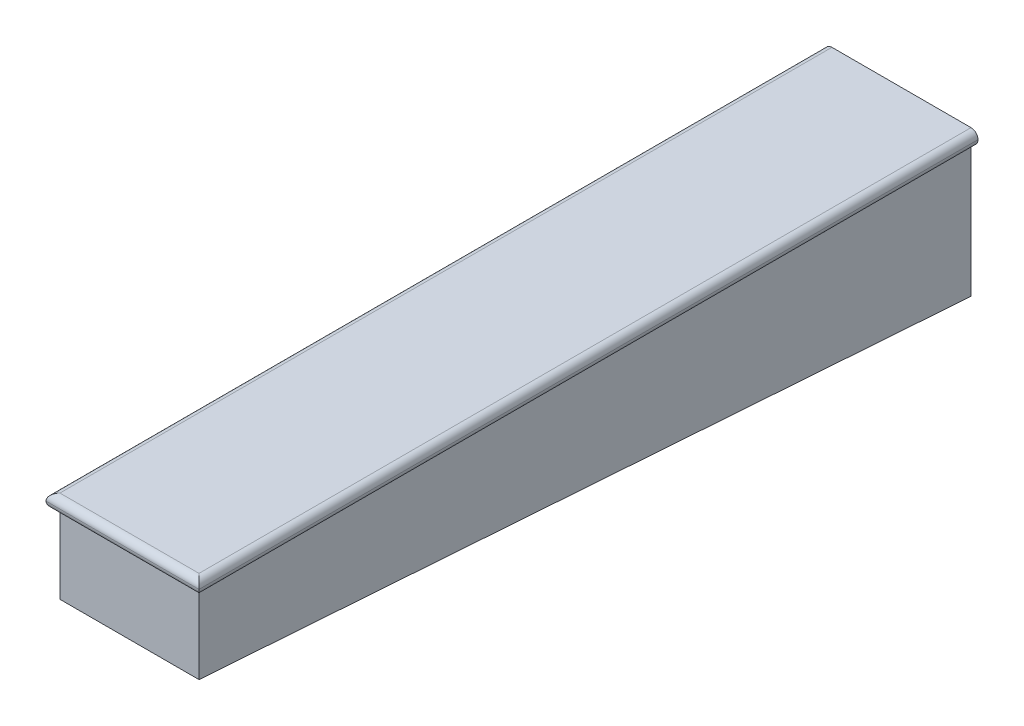
ISO-10303-21;
HEADER;
FILE_DESCRIPTION(('STEP AP214'),'2;1');
FILE_NAME('part.step','',(''),(''),'','','');
FILE_SCHEMA(('AUTOMOTIVE_DESIGN { 1 0 10303 214 1 1 1 1 }'));
ENDSEC;
DATA;
#1=APPLICATION_CONTEXT('core data for automotive mechanical design processes');
#2=APPLICATION_PROTOCOL_DEFINITION('international standard','automotive_design',2000,#1);
#3=PRODUCT_CONTEXT('',#1,'mechanical');
#4=PRODUCT('Part','Part','',(#3));
#5=PRODUCT_RELATED_PRODUCT_CATEGORY('part','',(#4));
#6=PRODUCT_DEFINITION_FORMATION('','',#4);
#7=PRODUCT_DEFINITION_CONTEXT('part definition',#1,'design');
#8=PRODUCT_DEFINITION('design','',#6,#7);
#9=PRODUCT_DEFINITION_SHAPE('','',#8);
#10=(LENGTH_UNIT() NAMED_UNIT(*) SI_UNIT(.MILLI.,.METRE.));
#11=(NAMED_UNIT(*) PLANE_ANGLE_UNIT() SI_UNIT($,.RADIAN.));
#12=(NAMED_UNIT(*) SI_UNIT($,.STERADIAN.) SOLID_ANGLE_UNIT());
#13=UNCERTAINTY_MEASURE_WITH_UNIT(LENGTH_MEASURE(1.E-05),#10,'distance_accuracy_value','');
#14=(GEOMETRIC_REPRESENTATION_CONTEXT(3) GLOBAL_UNCERTAINTY_ASSIGNED_CONTEXT((#13)) GLOBAL_UNIT_ASSIGNED_CONTEXT((#10,
#11,#12)) REPRESENTATION_CONTEXT('',''));
#15=CARTESIAN_POINT('',(0.,0.,0.));
#16=DIRECTION('',(0.,0.,1.));
#17=DIRECTION('',(1.,0.,0.));
#18=AXIS2_PLACEMENT_3D('',#15,#16,#17);
#19=CARTESIAN_POINT('',(0.,21.,0.));
#20=DIRECTION('',(0.,0.,1.));
#21=DIRECTION('',(1.,0.,0.));
#22=AXIS2_PLACEMENT_3D('',#19,#20,#21);
#23=PLANE('',#22);
#24=CARTESIAN_POINT('',(21.,20.,0.));
#25=DIRECTION('',(0.,0.,1.));
#26=DIRECTION('',(1.,0.,0.));
#27=AXIS2_PLACEMENT_3D('',#24,#25,#26);
#28=CIRCLE('',#27,1.);
#29=CARTESIAN_POINT('',(21.,21.,0.));
#30=VERTEX_POINT('',#29);
#31=CARTESIAN_POINT('',(22.,20.,0.));
#32=VERTEX_POINT('',#31);
#33=EDGE_CURVE('E121',#30,#32,#28,.F.);
#34=ORIENTED_EDGE('',*,*,#33,.T.);
#35=CARTESIAN_POINT('',(21.,20.,0.));
#36=DIRECTION('',(0.,0.,1.));
#37=DIRECTION('',(1.,0.,0.));
#38=AXIS2_PLACEMENT_3D('',#35,#36,#37);
#39=CIRCLE('',#38,1.);
#40=CARTESIAN_POINT('',(21.,19.,0.));
#41=VERTEX_POINT('',#40);
#42=EDGE_CURVE('E125',#32,#41,#39,.F.);
#43=ORIENTED_EDGE('',*,*,#42,.T.);
#44=DIRECTION('',(0.,-1.,0.));
#45=VECTOR('',#44,1.);
#46=CARTESIAN_POINT('',(21.,135.140264587042,0.));
#47=LINE('',#46,#45);
#48=CARTESIAN_POINT('',(21.,0.,0.));
#49=VERTEX_POINT('',#48);
#50=EDGE_CURVE('E168',#41,#49,#47,.T.);
#51=ORIENTED_EDGE('',*,*,#50,.T.);
#52=DIRECTION('',(-1.,0.,0.));
#53=VECTOR('',#52,1.);
#54=CARTESIAN_POINT('',(0.,0.,0.));
#55=LINE('',#54,#53);
#56=CARTESIAN_POINT('',(1.00000000000001,0.,0.));
#57=VERTEX_POINT('',#56);
#58=EDGE_CURVE('E186',#49,#57,#55,.T.);
#59=ORIENTED_EDGE('',*,*,#58,.T.);
#60=DIRECTION('',(0.,-1.,0.));
#61=VECTOR('',#60,1.);
#62=CARTESIAN_POINT('',(1.00000000000001,135.140264587042,0.));
#63=LINE('',#62,#61);
#64=CARTESIAN_POINT('',(1.00000000000001,19.,0.));
#65=VERTEX_POINT('',#64);
#66=EDGE_CURVE('E181',#65,#57,#63,.T.);
#67=ORIENTED_EDGE('',*,*,#66,.F.);
#68=CARTESIAN_POINT('',(1.,20.,0.));
#69=DIRECTION('',(0.,0.,1.));
#70=DIRECTION('',(1.,0.,0.));
#71=AXIS2_PLACEMENT_3D('',#68,#69,#70);
#72=CIRCLE('',#71,1.);
#73=CARTESIAN_POINT('',(0.,20.,0.));
#74=VERTEX_POINT('',#73);
#75=EDGE_CURVE('E132',#65,#74,#72,.F.);
#76=ORIENTED_EDGE('',*,*,#75,.T.);
#77=CARTESIAN_POINT('',(1.,20.,0.));
#78=DIRECTION('',(0.,0.,1.));
#79=DIRECTION('',(1.,0.,0.));
#80=AXIS2_PLACEMENT_3D('',#77,#78,#79);
#81=CIRCLE('',#80,1.);
#82=CARTESIAN_POINT('',(1.,21.,0.));
#83=VERTEX_POINT('',#82);
#84=EDGE_CURVE('E185',#74,#83,#81,.F.);
#85=ORIENTED_EDGE('',*,*,#84,.T.);
#86=DIRECTION('',(-1.,0.,0.));
#87=VECTOR('',#86,1.);
#88=CARTESIAN_POINT('',(0.,21.,0.));
#89=LINE('',#88,#87);
#90=EDGE_CURVE('E128',#30,#83,#89,.T.);
#91=ORIENTED_EDGE('',*,*,#90,.F.);
#92=EDGE_LOOP('',(#34,#43,#51,#59,#67,#76,#85,#91));
#93=FACE_BOUND('',#92,.T.);
#94=ADVANCED_FACE('F47',(#93),#23,.F.);
#95=CARTESIAN_POINT('',(0.,21.,0.));
#96=DIRECTION('',(0.,1.,0.));
#97=DIRECTION('',(0.,0.,1.));
#98=AXIS2_PLACEMENT_3D('',#95,#96,#97);
#99=PLANE('',#98);
#100=DIRECTION('',(1.,0.,0.));
#101=VECTOR('',#100,1.);
#102=CARTESIAN_POINT('',(22.,21.,111.));
#103=LINE('',#102,#101);
#104=CARTESIAN_POINT('',(1.00000000000001,21.,111.));
#105=VERTEX_POINT('',#104);
#106=CARTESIAN_POINT('',(21.,21.,111.));
#107=VERTEX_POINT('',#106);
#108=EDGE_CURVE('E73',#105,#107,#103,.T.);
#109=ORIENTED_EDGE('',*,*,#108,.T.);
#110=DIRECTION('',(0.,0.,-1.));
#111=VECTOR('',#110,1.);
#112=CARTESIAN_POINT('',(21.,21.,0.));
#113=LINE('',#112,#111);
#114=EDGE_CURVE('E12',#107,#30,#113,.T.);
#115=ORIENTED_EDGE('',*,*,#114,.T.);
#116=ORIENTED_EDGE('',*,*,#90,.T.);
#117=DIRECTION('',(0.,0.,1.));
#118=VECTOR('',#117,1.);
#119=CARTESIAN_POINT('',(1.00000000000001,21.,112.));
#120=LINE('',#119,#118);
#121=EDGE_CURVE('E57',#83,#105,#120,.T.);
#122=ORIENTED_EDGE('',*,*,#121,.T.);
#123=EDGE_LOOP('',(#109,#115,#116,#122));
#124=FACE_BOUND('',#123,.T.);
#125=ADVANCED_FACE('F196',(#124),#99,.T.);
#126=CARTESIAN_POINT('',(21.,135.140264587042,0.));
#127=DIRECTION('',(1.,0.,0.));
#128=DIRECTION('',(0.,0.,-1.));
#129=AXIS2_PLACEMENT_3D('',#126,#127,#128);
#130=PLANE('',#129);
#131=DIRECTION('',(0.,0.0698087234221514,0.997560395231371));
#132=VECTOR('',#131,1.);
#133=CARTESIAN_POINT('',(21.,0.658573357389225,9.41095419713067));
#134=LINE('',#133,#132);
#135=CARTESIAN_POINT('',(21.,7.76771846286216,111.));
#136=VERTEX_POINT('',#135);
#137=EDGE_CURVE('E153',#49,#136,#134,.T.);
#138=ORIENTED_EDGE('',*,*,#137,.F.);
#139=ORIENTED_EDGE('',*,*,#50,.F.);
#140=DIRECTION('',(0.,0.,1.));
#141=VECTOR('',#140,1.);
#142=CARTESIAN_POINT('',(21.,19.,0.));
#143=LINE('',#142,#141);
#144=CARTESIAN_POINT('',(21.,19.,111.));
#145=VERTEX_POINT('',#144);
#146=EDGE_CURVE('E143',#41,#145,#143,.T.);
#147=ORIENTED_EDGE('',*,*,#146,.T.);
#148=DIRECTION('',(0.,-1.,0.));
#149=VECTOR('',#148,1.);
#150=CARTESIAN_POINT('',(21.,135.140264587042,111.));
#151=LINE('',#150,#149);
#152=EDGE_CURVE('E177',#145,#136,#151,.T.);
#153=ORIENTED_EDGE('',*,*,#152,.T.);
#154=EDGE_LOOP('',(#138,#139,#147,#153));
#155=FACE_BOUND('',#154,.T.);
#156=ADVANCED_FACE('F198',(#155),#130,.T.);
#157=CARTESIAN_POINT('',(0.,135.140264587042,111.));
#158=DIRECTION('',(0.,0.,-1.));
#159=DIRECTION('',(-1.,0.,0.));
#160=AXIS2_PLACEMENT_3D('',#157,#158,#159);
#161=PLANE('',#160);
#162=DIRECTION('',(0.,-1.,0.));
#163=VECTOR('',#162,1.);
#164=CARTESIAN_POINT('',(1.,135.140264587042,111.));
#165=LINE('',#164,#163);
#166=CARTESIAN_POINT('',(1.,19.,111.));
#167=VERTEX_POINT('',#166);
#168=CARTESIAN_POINT('',(1.,7.76771846286217,111.));
#169=VERTEX_POINT('',#168);
#170=EDGE_CURVE('E248',#167,#169,#165,.T.);
#171=ORIENTED_EDGE('',*,*,#170,.T.);
#172=DIRECTION('',(-1.,0.,0.));
#173=VECTOR('',#172,1.);
#174=CARTESIAN_POINT('',(22.,7.76771846286216,111.));
#175=LINE('',#174,#173);
#176=EDGE_CURVE('E65',#136,#169,#175,.T.);
#177=ORIENTED_EDGE('',*,*,#176,.F.);
#178=ORIENTED_EDGE('',*,*,#152,.F.);
#179=DIRECTION('',(1.,0.,0.));
#180=VECTOR('',#179,1.);
#181=CARTESIAN_POINT('',(0.,19.,111.));
#182=LINE('',#181,#180);
#183=EDGE_CURVE('E172',#167,#145,#182,.T.);
#184=ORIENTED_EDGE('',*,*,#183,.F.);
#185=EDGE_LOOP('',(#171,#177,#178,#184));
#186=FACE_BOUND('',#185,.T.);
#187=ADVANCED_FACE('F204',(#186),#161,.F.);
#188=CARTESIAN_POINT('',(1.00000000000001,135.140264587042,0.));
#189=DIRECTION('',(-1.,0.,0.));
#190=DIRECTION('',(0.,0.,1.));
#191=AXIS2_PLACEMENT_3D('',#188,#189,#190);
#192=PLANE('',#191);
#193=DIRECTION('',(0.,-0.0698087234221514,-0.997560395231371));
#194=VECTOR('',#193,1.);
#195=CARTESIAN_POINT('',(1.,7.76771846286216,111.));
#196=LINE('',#195,#194);
#197=EDGE_CURVE('E250',#169,#57,#196,.T.);
#198=ORIENTED_EDGE('',*,*,#197,.F.);
#199=ORIENTED_EDGE('',*,*,#170,.F.);
#200=DIRECTION('',(0.,0.,-1.));
#201=VECTOR('',#200,1.);
#202=CARTESIAN_POINT('',(1.00000000000001,19.,0.));
#203=LINE('',#202,#201);
#204=EDGE_CURVE('E189',#167,#65,#203,.T.);
#205=ORIENTED_EDGE('',*,*,#204,.T.);
#206=ORIENTED_EDGE('',*,*,#66,.T.);
#207=EDGE_LOOP('',(#198,#199,#205,#206));
#208=FACE_BOUND('',#207,.T.);
#209=ADVANCED_FACE('F226',(#208),#192,.T.);
#210=CARTESIAN_POINT('',(1.,20.,0.));
#211=DIRECTION('',(0.,0.,-1.));
#212=DIRECTION('',(-1.,0.,0.));
#213=AXIS2_PLACEMENT_3D('',#210,#211,#212);
#214=CYLINDRICAL_SURFACE('',#213,1.);
#215=ORIENTED_EDGE('',*,*,#121,.F.);
#216=ORIENTED_EDGE('',*,*,#84,.F.);
#217=DIRECTION('',(0.,0.,1.));
#218=VECTOR('',#217,1.);
#219=CARTESIAN_POINT('',(0.,20.,0.));
#220=LINE('',#219,#218);
#221=CARTESIAN_POINT('',(0.,20.,112.));
#222=VERTEX_POINT('',#221);
#223=EDGE_CURVE('E51',#222,#74,#220,.F.);
#224=ORIENTED_EDGE('',*,*,#223,.F.);
#225=CARTESIAN_POINT('',(1.00000000000001,20.,111.));
#226=DIRECTION('',(-0.707106781186548,0.,-0.707106781186547));
#227=DIRECTION('',(-0.707106781186547,0.,0.707106781186548));
#228=AXIS2_PLACEMENT_3D('',#225,#226,#227);
#229=ELLIPSE('',#228,1.41421356237309,1.);
#230=EDGE_CURVE('E163',#105,#222,#229,.F.);
#231=ORIENTED_EDGE('',*,*,#230,.F.);
#232=EDGE_LOOP('',(#215,#216,#224,#231));
#233=FACE_BOUND('',#232,.T.);
#234=ADVANCED_FACE('F49',(#233),#214,.T.);
#235=CARTESIAN_POINT('',(1.,20.,0.));
#236=DIRECTION('',(0.,0.,-1.));
#237=DIRECTION('',(-1.,0.,0.));
#238=AXIS2_PLACEMENT_3D('',#235,#236,#237);
#239=CYLINDRICAL_SURFACE('',#238,1.);
#240=ORIENTED_EDGE('',*,*,#75,.F.);
#241=ORIENTED_EDGE('',*,*,#204,.F.);
#242=CARTESIAN_POINT('',(1.00000000000001,20.,111.));
#243=DIRECTION('',(0.707106781186548,0.,0.707106781186547));
#244=DIRECTION('',(0.707106781186547,0.,-0.707106781186548));
#245=AXIS2_PLACEMENT_3D('',#242,#243,#244);
#246=ELLIPSE('',#245,1.41421356237309,1.);
#247=EDGE_CURVE('E158',#222,#167,#246,.T.);
#248=ORIENTED_EDGE('',*,*,#247,.F.);
#249=ORIENTED_EDGE('',*,*,#223,.T.);
#250=EDGE_LOOP('',(#240,#241,#248,#249));
#251=FACE_BOUND('',#250,.T.);
#252=ADVANCED_FACE('F222',(#251),#239,.T.);
#253=CARTESIAN_POINT('',(0.,20.,111.));
#254=DIRECTION('',(-1.,0.,0.));
#255=DIRECTION('',(0.,0.,1.));
#256=AXIS2_PLACEMENT_3D('',#253,#254,#255);
#257=CYLINDRICAL_SURFACE('',#256,1.);
#258=CARTESIAN_POINT('',(21.,20.,111.));
#259=DIRECTION('',(-0.707106781186547,0.,0.707106781186548));
#260=DIRECTION('',(-0.707106781186547,0.,-0.707106781186547));
#261=AXIS2_PLACEMENT_3D('',#258,#259,#260);
#262=ELLIPSE('',#261,1.4142135623731,1.);
#263=CARTESIAN_POINT('',(22.,20.,112.));
#264=VERTEX_POINT('',#263);
#265=EDGE_CURVE('E136',#107,#264,#262,.F.);
#266=ORIENTED_EDGE('',*,*,#265,.F.);
#267=ORIENTED_EDGE('',*,*,#108,.F.);
#268=ORIENTED_EDGE('',*,*,#230,.T.);
#269=DIRECTION('',(1.,0.,0.));
#270=VECTOR('',#269,1.);
#271=CARTESIAN_POINT('',(0.,20.,112.));
#272=LINE('',#271,#270);
#273=EDGE_CURVE('E139',#264,#222,#272,.F.);
#274=ORIENTED_EDGE('',*,*,#273,.F.);
#275=EDGE_LOOP('',(#266,#267,#268,#274));
#276=FACE_BOUND('',#275,.T.);
#277=ADVANCED_FACE('F220',(#276),#257,.T.);
#278=CARTESIAN_POINT('',(21.,20.,0.));
#279=DIRECTION('',(0.,0.,1.));
#280=DIRECTION('',(1.,0.,0.));
#281=AXIS2_PLACEMENT_3D('',#278,#279,#280);
#282=CYLINDRICAL_SURFACE('',#281,1.);
#283=ORIENTED_EDGE('',*,*,#114,.F.);
#284=ORIENTED_EDGE('',*,*,#265,.T.);
#285=DIRECTION('',(0.,0.,-1.));
#286=VECTOR('',#285,1.);
#287=CARTESIAN_POINT('',(22.,20.,112.));
#288=LINE('',#287,#286);
#289=EDGE_CURVE('E134',#32,#264,#288,.F.);
#290=ORIENTED_EDGE('',*,*,#289,.F.);
#291=ORIENTED_EDGE('',*,*,#33,.F.);
#292=EDGE_LOOP('',(#283,#284,#290,#291));
#293=FACE_BOUND('',#292,.T.);
#294=ADVANCED_FACE('F135',(#293),#282,.T.);
#295=CARTESIAN_POINT('',(0.,20.,111.));
#296=DIRECTION('',(1.,0.,0.));
#297=DIRECTION('',(0.,0.,-1.));
#298=AXIS2_PLACEMENT_3D('',#295,#296,#297);
#299=CYLINDRICAL_SURFACE('',#298,1.);
#300=ORIENTED_EDGE('',*,*,#247,.T.);
#301=ORIENTED_EDGE('',*,*,#183,.T.);
#302=CARTESIAN_POINT('',(21.,20.,111.));
#303=DIRECTION('',(0.707106781186547,0.,-0.707106781186548));
#304=DIRECTION('',(0.707106781186547,0.,0.707106781186547));
#305=AXIS2_PLACEMENT_3D('',#302,#303,#304);
#306=ELLIPSE('',#305,1.4142135623731,1.);
#307=EDGE_CURVE('E97',#264,#145,#306,.T.);
#308=ORIENTED_EDGE('',*,*,#307,.F.);
#309=ORIENTED_EDGE('',*,*,#273,.T.);
#310=EDGE_LOOP('',(#300,#301,#308,#309));
#311=FACE_BOUND('',#310,.T.);
#312=ADVANCED_FACE('F214',(#311),#299,.T.);
#313=CARTESIAN_POINT('',(21.,20.,0.));
#314=DIRECTION('',(0.,0.,1.));
#315=DIRECTION('',(1.,0.,0.));
#316=AXIS2_PLACEMENT_3D('',#313,#314,#315);
#317=CYLINDRICAL_SURFACE('',#316,1.);
#318=ORIENTED_EDGE('',*,*,#42,.F.);
#319=ORIENTED_EDGE('',*,*,#289,.T.);
#320=ORIENTED_EDGE('',*,*,#307,.T.);
#321=ORIENTED_EDGE('',*,*,#146,.F.);
#322=EDGE_LOOP('',(#318,#319,#320,#321));
#323=FACE_BOUND('',#322,.T.);
#324=ADVANCED_FACE('F141',(#323),#317,.T.);
#325=CARTESIAN_POINT('',(22.,7.76771846286216,111.));
#326=DIRECTION('',(0.,0.997560395231371,-0.0698087234221514));
#327=DIRECTION('',(0.,0.0698087234221514,0.997560395231371));
#328=AXIS2_PLACEMENT_3D('',#325,#326,#327);
#329=PLANE('',#328);
#330=ORIENTED_EDGE('',*,*,#137,.T.);
#331=ORIENTED_EDGE('',*,*,#176,.T.);
#332=ORIENTED_EDGE('',*,*,#197,.T.);
#333=ORIENTED_EDGE('',*,*,#58,.F.);
#334=EDGE_LOOP('',(#330,#331,#332,#333));
#335=FACE_BOUND('',#334,.T.);
#336=ADVANCED_FACE('F213',(#335),#329,.F.);
#337=CLOSED_SHELL('',(#94,#125,#156,#187,#209,#234,#252,#277,#294,#312,#324,#336));
#338=MANIFOLD_SOLID_BREP('B2',#337);
#339=ADVANCED_BREP_SHAPE_REPRESENTATION('',(#18,#338),#14);
#340=SHAPE_DEFINITION_REPRESENTATION(#9,#339);
ENDSEC;
END-ISO-10303-21;
